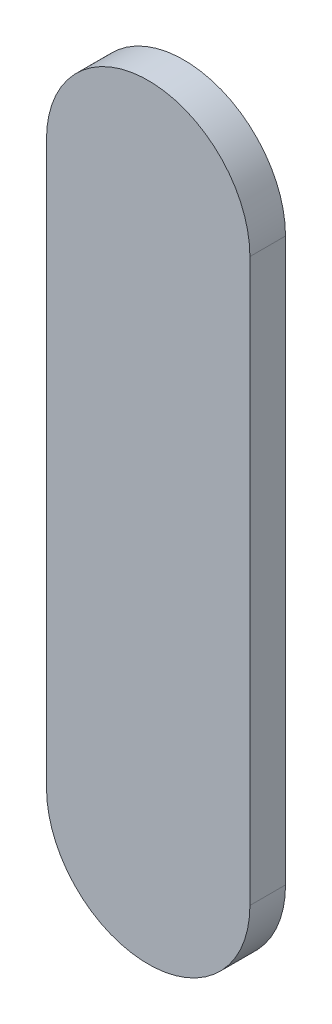
ISO-10303-21;
HEADER;
FILE_DESCRIPTION(('STEP AP214'),'2;1');
FILE_NAME('part.step','',(''),(''),'','','');
FILE_SCHEMA(('AUTOMOTIVE_DESIGN { 1 0 10303 214 1 1 1 1 }'));
ENDSEC;
DATA;
#1=APPLICATION_CONTEXT('core data for automotive mechanical design processes');
#2=APPLICATION_PROTOCOL_DEFINITION('international standard','automotive_design',2000,#1);
#3=PRODUCT_CONTEXT('',#1,'mechanical');
#4=PRODUCT('Part','Part','',(#3));
#5=PRODUCT_RELATED_PRODUCT_CATEGORY('part','',(#4));
#6=PRODUCT_DEFINITION_FORMATION('','',#4);
#7=PRODUCT_DEFINITION_CONTEXT('part definition',#1,'design');
#8=PRODUCT_DEFINITION('design','',#6,#7);
#9=PRODUCT_DEFINITION_SHAPE('','',#8);
#10=(LENGTH_UNIT() NAMED_UNIT(*) SI_UNIT(.MILLI.,.METRE.));
#11=(NAMED_UNIT(*) PLANE_ANGLE_UNIT() SI_UNIT($,.RADIAN.));
#12=(NAMED_UNIT(*) SI_UNIT($,.STERADIAN.) SOLID_ANGLE_UNIT());
#13=UNCERTAINTY_MEASURE_WITH_UNIT(LENGTH_MEASURE(1.E-05),#10,'distance_accuracy_value','');
#14=(GEOMETRIC_REPRESENTATION_CONTEXT(3) GLOBAL_UNCERTAINTY_ASSIGNED_CONTEXT((#13)) GLOBAL_UNIT_ASSIGNED_CONTEXT((#10,
#11,#12)) REPRESENTATION_CONTEXT('',''));
#15=CARTESIAN_POINT('',(0.,0.,0.));
#16=DIRECTION('',(0.,0.,1.));
#17=DIRECTION('',(1.,0.,0.));
#18=AXIS2_PLACEMENT_3D('',#15,#16,#17);
#19=CARTESIAN_POINT('',(82.35,-108.91,1.635));
#20=DIRECTION('',(0.,0.,1.));
#21=DIRECTION('',(1.,0.,0.));
#22=AXIS2_PLACEMENT_3D('',#19,#20,#21);
#23=PLANE('',#22);
#24=DIRECTION('',(0.,-1.,0.));
#25=VECTOR('',#24,1.);
#26=CARTESIAN_POINT('',(82.35,-108.91,1.635));
#27=LINE('',#26,#25);
#28=CARTESIAN_POINT('',(82.35,-108.91,1.635));
#29=VERTEX_POINT('',#28);
#30=CARTESIAN_POINT('',(82.35,-109.4625,1.635));
#31=VERTEX_POINT('',#30);
#32=EDGE_CURVE('E81',#29,#31,#27,.T.);
#33=ORIENTED_EDGE('',*,*,#32,.T.);
#34=CARTESIAN_POINT('',(82.45,-109.4625,1.635));
#35=DIRECTION('',(0.,0.,1.));
#36=DIRECTION('',(-1.,0.,0.));
#37=AXIS2_PLACEMENT_3D('',#34,#35,#36);
#38=CIRCLE('',#37,0.1);
#39=CARTESIAN_POINT('',(82.55,-109.4625,1.635));
#40=VERTEX_POINT('',#39);
#41=EDGE_CURVE('E106',#31,#40,#38,.T.);
#42=ORIENTED_EDGE('',*,*,#41,.T.);
#43=DIRECTION('',(0.,1.,0.));
#44=VECTOR('',#43,1.);
#45=CARTESIAN_POINT('',(82.55,-109.4625,1.635));
#46=LINE('',#45,#44);
#47=CARTESIAN_POINT('',(82.55,-108.91,1.635));
#48=VERTEX_POINT('',#47);
#49=EDGE_CURVE('E74',#40,#48,#46,.T.);
#50=ORIENTED_EDGE('',*,*,#49,.T.);
#51=CARTESIAN_POINT('',(82.45,-108.91,1.635));
#52=DIRECTION('',(0.,0.,1.));
#53=DIRECTION('',(1.,0.,0.));
#54=AXIS2_PLACEMENT_3D('',#51,#52,#53);
#55=CIRCLE('',#54,0.1);
#56=EDGE_CURVE('E11',#48,#29,#55,.T.);
#57=ORIENTED_EDGE('',*,*,#56,.T.);
#58=EDGE_LOOP('',(#33,#42,#50,#57));
#59=FACE_BOUND('',#58,.T.);
#60=ADVANCED_FACE('F17',(#59),#23,.T.);
#61=CARTESIAN_POINT('',(82.35,-108.91,1.6));
#62=DIRECTION('',(0.,0.,1.));
#63=DIRECTION('',(1.,0.,0.));
#64=AXIS2_PLACEMENT_3D('',#61,#62,#63);
#65=PLANE('',#64);
#66=CARTESIAN_POINT('',(82.45,-108.91,1.6));
#67=DIRECTION('',(0.,0.,1.));
#68=DIRECTION('',(1.,0.,0.));
#69=AXIS2_PLACEMENT_3D('',#66,#67,#68);
#70=CIRCLE('',#69,0.1);
#71=CARTESIAN_POINT('',(82.55,-108.91,1.6));
#72=VERTEX_POINT('',#71);
#73=CARTESIAN_POINT('',(82.35,-108.91,1.6));
#74=VERTEX_POINT('',#73);
#75=EDGE_CURVE('E20',#72,#74,#70,.T.);
#76=ORIENTED_EDGE('',*,*,#75,.F.);
#77=DIRECTION('',(0.,1.,0.));
#78=VECTOR('',#77,1.);
#79=CARTESIAN_POINT('',(82.55,-109.4625,1.6));
#80=LINE('',#79,#78);
#81=CARTESIAN_POINT('',(82.55,-109.4625,1.6));
#82=VERTEX_POINT('',#81);
#83=EDGE_CURVE('E111',#82,#72,#80,.T.);
#84=ORIENTED_EDGE('',*,*,#83,.F.);
#85=CARTESIAN_POINT('',(82.45,-109.4625,1.6));
#86=DIRECTION('',(0.,0.,1.));
#87=DIRECTION('',(-1.,0.,0.));
#88=AXIS2_PLACEMENT_3D('',#85,#86,#87);
#89=CIRCLE('',#88,0.1);
#90=CARTESIAN_POINT('',(82.35,-109.4625,1.6));
#91=VERTEX_POINT('',#90);
#92=EDGE_CURVE('E83',#91,#82,#89,.T.);
#93=ORIENTED_EDGE('',*,*,#92,.F.);
#94=DIRECTION('',(0.,-1.,0.));
#95=VECTOR('',#94,1.);
#96=CARTESIAN_POINT('',(82.35,-108.91,1.6));
#97=LINE('',#96,#95);
#98=EDGE_CURVE('E79',#74,#91,#97,.T.);
#99=ORIENTED_EDGE('',*,*,#98,.F.);
#100=EDGE_LOOP('',(#76,#84,#93,#99));
#101=FACE_BOUND('',#100,.T.);
#102=ADVANCED_FACE('F85',(#101),#65,.F.);
#103=CARTESIAN_POINT('',(82.45,-108.91,1.6));
#104=DIRECTION('',(0.,0.,-1.));
#105=DIRECTION('',(1.,0.,0.));
#106=AXIS2_PLACEMENT_3D('',#103,#104,#105);
#107=CYLINDRICAL_SURFACE('',#106,0.1);
#108=ORIENTED_EDGE('',*,*,#75,.T.);
#109=DIRECTION('',(0.,0.,1.));
#110=VECTOR('',#109,1.);
#111=CARTESIAN_POINT('',(82.35,-108.91,1.6));
#112=LINE('',#111,#110);
#113=EDGE_CURVE('E68',#74,#29,#112,.T.);
#114=ORIENTED_EDGE('',*,*,#113,.T.);
#115=ORIENTED_EDGE('',*,*,#56,.F.);
#116=DIRECTION('',(0.,0.,1.));
#117=VECTOR('',#116,1.);
#118=CARTESIAN_POINT('',(82.55,-108.91,1.6));
#119=LINE('',#118,#117);
#120=EDGE_CURVE('E71',#72,#48,#119,.T.);
#121=ORIENTED_EDGE('',*,*,#120,.F.);
#122=EDGE_LOOP('',(#108,#114,#115,#121));
#123=FACE_BOUND('',#122,.T.);
#124=ADVANCED_FACE('F67',(#123),#107,.T.);
#125=CARTESIAN_POINT('',(82.55,-109.4625,1.6));
#126=DIRECTION('',(-1.,0.,0.));
#127=DIRECTION('',(0.,0.,1.));
#128=AXIS2_PLACEMENT_3D('',#125,#126,#127);
#129=PLANE('',#128);
#130=ORIENTED_EDGE('',*,*,#83,.T.);
#131=ORIENTED_EDGE('',*,*,#120,.T.);
#132=ORIENTED_EDGE('',*,*,#49,.F.);
#133=DIRECTION('',(0.,0.,1.));
#134=VECTOR('',#133,1.);
#135=CARTESIAN_POINT('',(82.55,-109.4625,1.6));
#136=LINE('',#135,#134);
#137=EDGE_CURVE('E103',#82,#40,#136,.T.);
#138=ORIENTED_EDGE('',*,*,#137,.F.);
#139=EDGE_LOOP('',(#130,#131,#132,#138));
#140=FACE_BOUND('',#139,.T.);
#141=ADVANCED_FACE('F117',(#140),#129,.F.);
#142=CARTESIAN_POINT('',(82.45,-109.4625,1.6));
#143=DIRECTION('',(0.,0.,-1.));
#144=DIRECTION('',(-1.,0.,0.));
#145=AXIS2_PLACEMENT_3D('',#142,#143,#144);
#146=CYLINDRICAL_SURFACE('',#145,0.1);
#147=ORIENTED_EDGE('',*,*,#92,.T.);
#148=ORIENTED_EDGE('',*,*,#137,.T.);
#149=ORIENTED_EDGE('',*,*,#41,.F.);
#150=DIRECTION('',(0.,0.,1.));
#151=VECTOR('',#150,1.);
#152=CARTESIAN_POINT('',(82.35,-109.4625,1.6));
#153=LINE('',#152,#151);
#154=EDGE_CURVE('E89',#91,#31,#153,.T.);
#155=ORIENTED_EDGE('',*,*,#154,.F.);
#156=EDGE_LOOP('',(#147,#148,#149,#155));
#157=FACE_BOUND('',#156,.T.);
#158=ADVANCED_FACE('F120',(#157),#146,.T.);
#159=CARTESIAN_POINT('',(82.35,-108.91,1.6));
#160=DIRECTION('',(1.,0.,0.));
#161=DIRECTION('',(0.,1.,0.));
#162=AXIS2_PLACEMENT_3D('',#159,#160,#161);
#163=PLANE('',#162);
#164=ORIENTED_EDGE('',*,*,#98,.T.);
#165=ORIENTED_EDGE('',*,*,#154,.T.);
#166=ORIENTED_EDGE('',*,*,#32,.F.);
#167=ORIENTED_EDGE('',*,*,#113,.F.);
#168=EDGE_LOOP('',(#164,#165,#166,#167));
#169=FACE_BOUND('',#168,.T.);
#170=ADVANCED_FACE('F77',(#169),#163,.F.);
#171=CLOSED_SHELL('',(#60,#102,#124,#141,#158,#170));
#172=MANIFOLD_SOLID_BREP('B1',#171);
#173=ADVANCED_BREP_SHAPE_REPRESENTATION('',(#18,#172),#14);
#174=SHAPE_DEFINITION_REPRESENTATION(#9,#173);
ENDSEC;
END-ISO-10303-21;
